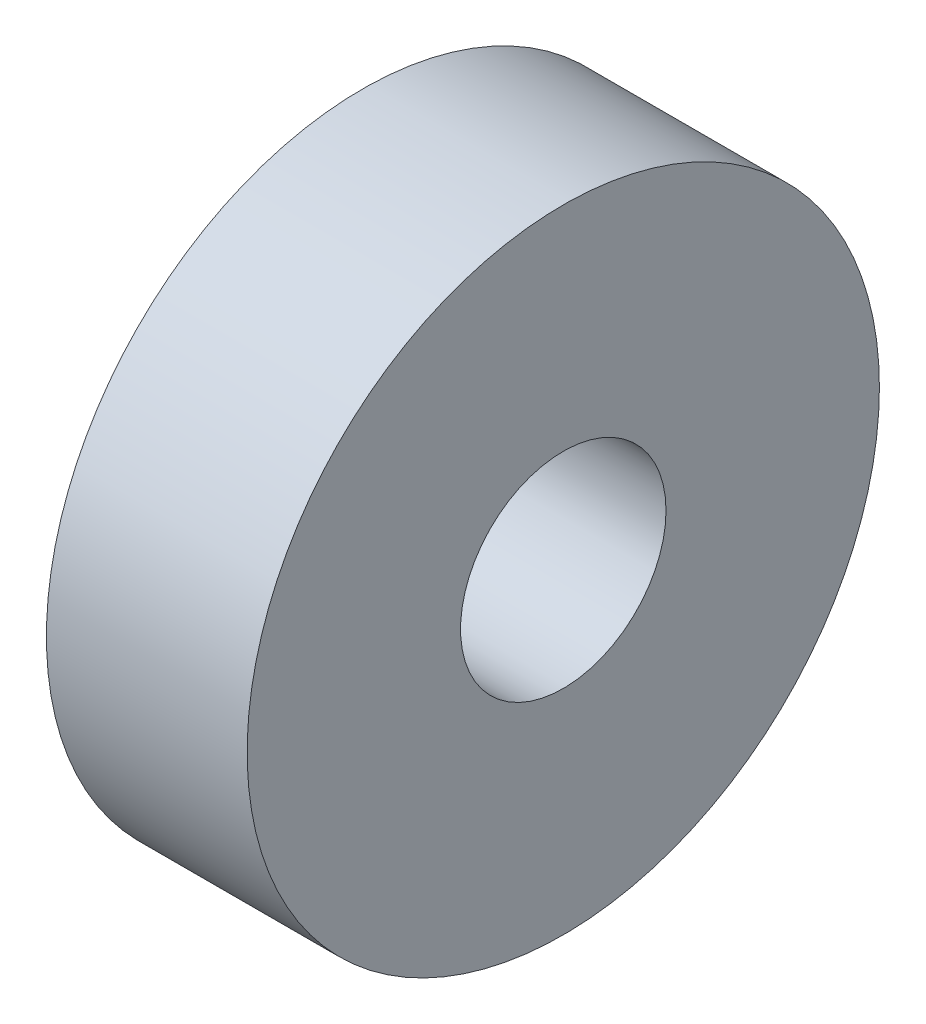
ISO-10303-21;
HEADER;
FILE_DESCRIPTION(('STEP AP214'),'2;1');
FILE_NAME('part.step','',(''),(''),'','','');
FILE_SCHEMA(('AUTOMOTIVE_DESIGN { 1 0 10303 214 1 1 1 1 }'));
ENDSEC;
DATA;
#1=APPLICATION_CONTEXT('core data for automotive mechanical design processes');
#2=APPLICATION_PROTOCOL_DEFINITION('international standard','automotive_design',2000,#1);
#3=PRODUCT_CONTEXT('',#1,'mechanical');
#4=PRODUCT('Part','Part','',(#3));
#5=PRODUCT_RELATED_PRODUCT_CATEGORY('part','',(#4));
#6=PRODUCT_DEFINITION_FORMATION('','',#4);
#7=PRODUCT_DEFINITION_CONTEXT('part definition',#1,'design');
#8=PRODUCT_DEFINITION('design','',#6,#7);
#9=PRODUCT_DEFINITION_SHAPE('','',#8);
#10=(LENGTH_UNIT() NAMED_UNIT(*) SI_UNIT(.MILLI.,.METRE.));
#11=(NAMED_UNIT(*) PLANE_ANGLE_UNIT() SI_UNIT($,.RADIAN.));
#12=(NAMED_UNIT(*) SI_UNIT($,.STERADIAN.) SOLID_ANGLE_UNIT());
#13=UNCERTAINTY_MEASURE_WITH_UNIT(LENGTH_MEASURE(1.E-05),#10,'distance_accuracy_value','');
#14=(GEOMETRIC_REPRESENTATION_CONTEXT(3) GLOBAL_UNCERTAINTY_ASSIGNED_CONTEXT((#13)) GLOBAL_UNIT_ASSIGNED_CONTEXT((#10,
#11,#12)) REPRESENTATION_CONTEXT('',''));
#15=CARTESIAN_POINT('',(0.,0.,0.));
#16=DIRECTION('',(0.,0.,1.));
#17=DIRECTION('',(1.,0.,0.));
#18=AXIS2_PLACEMENT_3D('',#15,#16,#17);
#19=CARTESIAN_POINT('',(6.35,0.,0.));
#20=DIRECTION('',(1.,0.,0.));
#21=DIRECTION('',(0.,0.,-1.));
#22=AXIS2_PLACEMENT_3D('',#19,#20,#21);
#23=PLANE('',#22);
#24=CARTESIAN_POINT('',(6.35,0.,0.));
#25=DIRECTION('',(1.,0.,0.));
#26=DIRECTION('',(0.,0.,-1.));
#27=AXIS2_PLACEMENT_3D('',#24,#25,#26);
#28=CIRCLE('',#27,10.);
#29=CARTESIAN_POINT('',(6.35,0.,-10.));
#30=VERTEX_POINT('',#29);
#31=EDGE_CURVE('E10',#30,#30,#28,.T.);
#32=ORIENTED_EDGE('',*,*,#31,.T.);
#33=EDGE_LOOP('',(#32));
#34=FACE_BOUND('',#33,.T.);
#35=CARTESIAN_POINT('',(6.35,0.,0.));
#36=DIRECTION('',(1.,0.,0.));
#37=DIRECTION('',(0.,0.,-1.));
#38=AXIS2_PLACEMENT_3D('',#35,#36,#37);
#39=CIRCLE('',#38,3.25);
#40=CARTESIAN_POINT('',(6.35,0.,-3.25));
#41=VERTEX_POINT('',#40);
#42=EDGE_CURVE('E46',#41,#41,#39,.T.);
#43=ORIENTED_EDGE('',*,*,#42,.F.);
#44=EDGE_LOOP('',(#43));
#45=FACE_BOUND('',#44,.T.);
#46=ADVANCED_FACE('F35',(#34,#45),#23,.T.);
#47=CARTESIAN_POINT('',(0.,0.,0.));
#48=DIRECTION('',(1.,0.,0.));
#49=DIRECTION('',(0.,0.,-1.));
#50=AXIS2_PLACEMENT_3D('',#47,#48,#49);
#51=PLANE('',#50);
#52=CARTESIAN_POINT('',(0.,0.,0.));
#53=DIRECTION('',(1.,0.,0.));
#54=DIRECTION('',(0.,0.,-1.));
#55=AXIS2_PLACEMENT_3D('',#52,#53,#54);
#56=CIRCLE('',#55,10.);
#57=CARTESIAN_POINT('',(0.,0.,-10.));
#58=VERTEX_POINT('',#57);
#59=EDGE_CURVE('E39',#58,#58,#56,.T.);
#60=ORIENTED_EDGE('',*,*,#59,.F.);
#61=EDGE_LOOP('',(#60));
#62=FACE_BOUND('',#61,.T.);
#63=CARTESIAN_POINT('',(0.,0.,0.));
#64=DIRECTION('',(1.,0.,0.));
#65=DIRECTION('',(0.,0.,-1.));
#66=AXIS2_PLACEMENT_3D('',#63,#64,#65);
#67=CIRCLE('',#66,3.25);
#68=CARTESIAN_POINT('',(0.,0.,-3.25));
#69=VERTEX_POINT('',#68);
#70=EDGE_CURVE('E48',#69,#69,#67,.T.);
#71=ORIENTED_EDGE('',*,*,#70,.T.);
#72=EDGE_LOOP('',(#71));
#73=FACE_BOUND('',#72,.T.);
#74=ADVANCED_FACE('F58',(#62,#73),#51,.F.);
#75=CARTESIAN_POINT('',(6.35,0.,0.));
#76=DIRECTION('',(-1.,0.,0.));
#77=DIRECTION('',(0.,0.,1.));
#78=AXIS2_PLACEMENT_3D('',#75,#76,#77);
#79=CYLINDRICAL_SURFACE('',#78,10.);
#80=ORIENTED_EDGE('',*,*,#31,.F.);
#81=EDGE_LOOP('',(#80));
#82=FACE_BOUND('',#81,.T.);
#83=ORIENTED_EDGE('',*,*,#59,.T.);
#84=EDGE_LOOP('',(#83));
#85=FACE_BOUND('',#84,.T.);
#86=ADVANCED_FACE('F37',(#82,#85),#79,.T.);
#87=CARTESIAN_POINT('',(6.35,0.,0.));
#88=DIRECTION('',(-1.,0.,0.));
#89=DIRECTION('',(0.,0.,1.));
#90=AXIS2_PLACEMENT_3D('',#87,#88,#89);
#91=CYLINDRICAL_SURFACE('',#90,3.25);
#92=ORIENTED_EDGE('',*,*,#42,.T.);
#93=EDGE_LOOP('',(#92));
#94=FACE_BOUND('',#93,.T.);
#95=ORIENTED_EDGE('',*,*,#70,.F.);
#96=EDGE_LOOP('',(#95));
#97=FACE_BOUND('',#96,.T.);
#98=ADVANCED_FACE('F54',(#94,#97),#91,.F.);
#99=CLOSED_SHELL('',(#46,#74,#86,#98));
#100=MANIFOLD_SOLID_BREP('B2',#99);
#101=ADVANCED_BREP_SHAPE_REPRESENTATION('',(#18,#100),#14);
#102=SHAPE_DEFINITION_REPRESENTATION(#9,#101);
ENDSEC;
END-ISO-10303-21;
